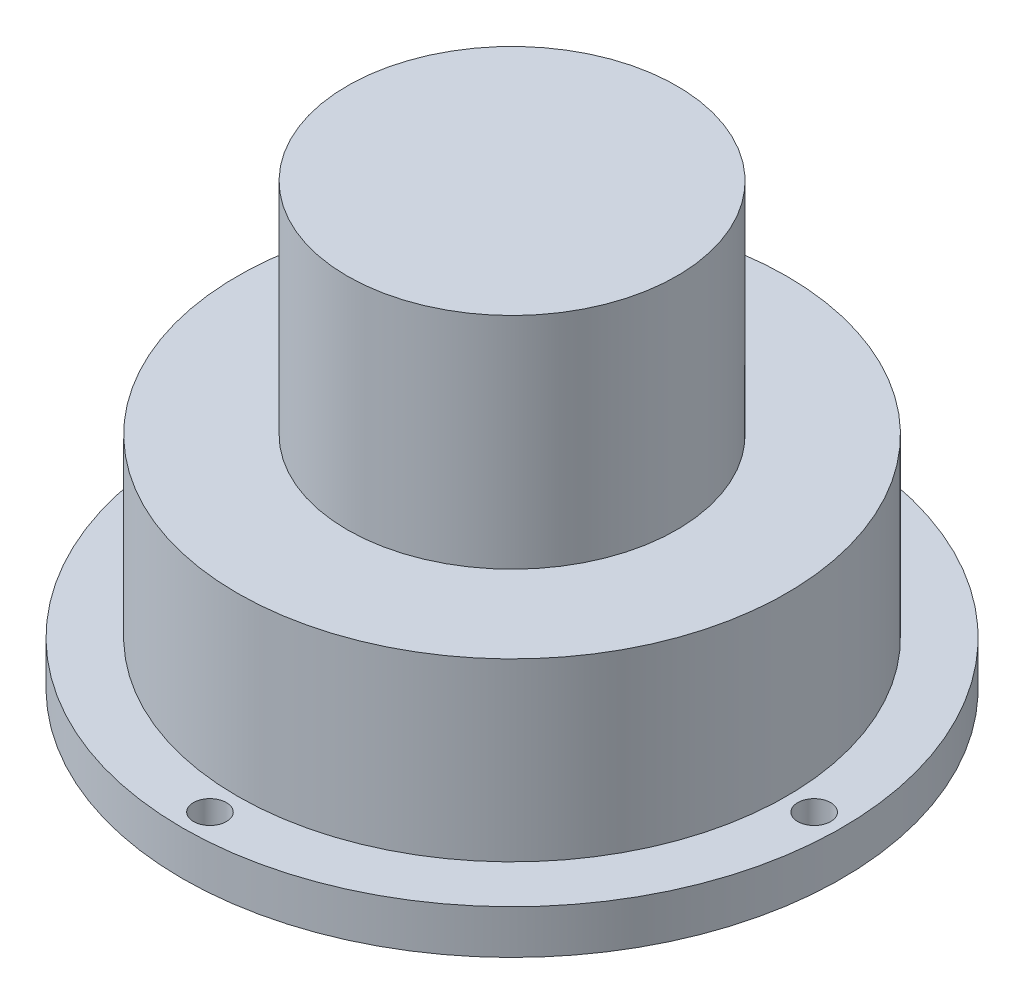
ISO-10303-21;
HEADER;
FILE_DESCRIPTION(('STEP AP214'),'2;1');
FILE_NAME('part.step','',(''),(''),'','','');
FILE_SCHEMA(('AUTOMOTIVE_DESIGN { 1 0 10303 214 1 1 1 1 }'));
ENDSEC;
DATA;
#1=APPLICATION_CONTEXT('core data for automotive mechanical design processes');
#2=APPLICATION_PROTOCOL_DEFINITION('international standard','automotive_design',2000,#1);
#3=PRODUCT_CONTEXT('',#1,'mechanical');
#4=PRODUCT('Part','Part','',(#3));
#5=PRODUCT_RELATED_PRODUCT_CATEGORY('part','',(#4));
#6=PRODUCT_DEFINITION_FORMATION('','',#4);
#7=PRODUCT_DEFINITION_CONTEXT('part definition',#1,'design');
#8=PRODUCT_DEFINITION('design','',#6,#7);
#9=PRODUCT_DEFINITION_SHAPE('','',#8);
#10=(LENGTH_UNIT() NAMED_UNIT(*) SI_UNIT(.MILLI.,.METRE.));
#11=(NAMED_UNIT(*) PLANE_ANGLE_UNIT() SI_UNIT($,.RADIAN.));
#12=(NAMED_UNIT(*) SI_UNIT($,.STERADIAN.) SOLID_ANGLE_UNIT());
#13=UNCERTAINTY_MEASURE_WITH_UNIT(LENGTH_MEASURE(1.E-05),#10,'distance_accuracy_value','');
#14=(GEOMETRIC_REPRESENTATION_CONTEXT(3) GLOBAL_UNCERTAINTY_ASSIGNED_CONTEXT((#13)) GLOBAL_UNIT_ASSIGNED_CONTEXT((#10,
#11,#12)) REPRESENTATION_CONTEXT('',''));
#15=CARTESIAN_POINT('',(0.,0.,0.));
#16=DIRECTION('',(0.,0.,1.));
#17=DIRECTION('',(1.,0.,0.));
#18=AXIS2_PLACEMENT_3D('',#15,#16,#17);
#19=CARTESIAN_POINT('',(0.,20.,0.));
#20=DIRECTION('',(0.,1.,0.));
#21=DIRECTION('',(0.,0.,1.));
#22=AXIS2_PLACEMENT_3D('',#19,#20,#21);
#23=PLANE('',#22);
#24=CARTESIAN_POINT('',(1.44023605227279E-12,20.,-137.5));
#25=DIRECTION('',(0.,1.,0.));
#26=DIRECTION('',(0.,0.,1.));
#27=AXIS2_PLACEMENT_3D('',#24,#25,#26);
#28=CIRCLE('',#27,7.5);
#29=CARTESIAN_POINT('',(1.44023605227279E-12,20.,-130.));
#30=VERTEX_POINT('',#29);
#31=EDGE_CURVE('E117',#30,#30,#28,.T.);
#32=ORIENTED_EDGE('',*,*,#31,.F.);
#33=EDGE_LOOP('',(#32));
#34=FACE_BOUND('',#33,.T.);
#35=CARTESIAN_POINT('',(-137.5,20.,0.));
#36=DIRECTION('',(0.,1.,0.));
#37=DIRECTION('',(0.,0.,1.));
#38=AXIS2_PLACEMENT_3D('',#35,#36,#37);
#39=CIRCLE('',#38,7.50000000000001);
#40=CARTESIAN_POINT('',(-137.5,20.,7.50000000000001));
#41=VERTEX_POINT('',#40);
#42=EDGE_CURVE('E119',#41,#41,#39,.T.);
#43=ORIENTED_EDGE('',*,*,#42,.F.);
#44=EDGE_LOOP('',(#43));
#45=FACE_BOUND('',#44,.T.);
#46=CARTESIAN_POINT('',(-4.80078684090931E-13,20.,137.5));
#47=DIRECTION('',(0.,1.,0.));
#48=DIRECTION('',(0.,0.,1.));
#49=AXIS2_PLACEMENT_3D('',#46,#47,#48);
#50=CIRCLE('',#49,7.5);
#51=CARTESIAN_POINT('',(-4.80078684090931E-13,20.,145.));
#52=VERTEX_POINT('',#51);
#53=EDGE_CURVE('E127',#52,#52,#50,.T.);
#54=ORIENTED_EDGE('',*,*,#53,.F.);
#55=EDGE_LOOP('',(#54));
#56=FACE_BOUND('',#55,.T.);
#57=CARTESIAN_POINT('',(137.5,20.,0.));
#58=DIRECTION('',(0.,1.,0.));
#59=DIRECTION('',(0.,0.,1.));
#60=AXIS2_PLACEMENT_3D('',#57,#58,#59);
#61=CIRCLE('',#60,7.50000000000001);
#62=CARTESIAN_POINT('',(137.5,20.,7.50000000000001));
#63=VERTEX_POINT('',#62);
#64=EDGE_CURVE('E133',#63,#63,#61,.T.);
#65=ORIENTED_EDGE('',*,*,#64,.F.);
#66=EDGE_LOOP('',(#65));
#67=FACE_BOUND('',#66,.T.);
#68=CARTESIAN_POINT('',(0.,20.,0.));
#69=DIRECTION('',(0.,1.,0.));
#70=DIRECTION('',(0.,0.,1.));
#71=AXIS2_PLACEMENT_3D('',#68,#69,#70);
#72=CIRCLE('',#71,150.);
#73=CARTESIAN_POINT('',(0.,20.,150.));
#74=VERTEX_POINT('',#73);
#75=EDGE_CURVE('E47',#74,#74,#72,.T.);
#76=ORIENTED_EDGE('',*,*,#75,.T.);
#77=EDGE_LOOP('',(#76));
#78=FACE_BOUND('',#77,.T.);
#79=CARTESIAN_POINT('',(0.,20.,0.));
#80=DIRECTION('',(0.,1.,0.));
#81=DIRECTION('',(0.,0.,1.));
#82=AXIS2_PLACEMENT_3D('',#79,#80,#81);
#83=CIRCLE('',#82,125.);
#84=CARTESIAN_POINT('',(0.,20.,125.));
#85=VERTEX_POINT('',#84);
#86=EDGE_CURVE('E59',#85,#85,#83,.T.);
#87=ORIENTED_EDGE('',*,*,#86,.F.);
#88=EDGE_LOOP('',(#87));
#89=FACE_BOUND('',#88,.T.);
#90=ADVANCED_FACE('F39',(#34,#45,#56,#67,#78,#89),#23,.T.);
#91=CARTESIAN_POINT('',(0.,0.,0.));
#92=DIRECTION('',(0.,1.,0.));
#93=DIRECTION('',(0.,0.,1.));
#94=AXIS2_PLACEMENT_3D('',#91,#92,#93);
#95=PLANE('',#94);
#96=CARTESIAN_POINT('',(1.44023605227279E-12,0.,-137.5));
#97=DIRECTION('',(0.,1.,0.));
#98=DIRECTION('',(0.,0.,1.));
#99=AXIS2_PLACEMENT_3D('',#96,#97,#98);
#100=CIRCLE('',#99,7.5);
#101=CARTESIAN_POINT('',(1.44023605227279E-12,0.,-130.));
#102=VERTEX_POINT('',#101);
#103=EDGE_CURVE('E114',#102,#102,#100,.T.);
#104=ORIENTED_EDGE('',*,*,#103,.T.);
#105=EDGE_LOOP('',(#104));
#106=FACE_BOUND('',#105,.T.);
#107=CARTESIAN_POINT('',(-137.5,0.,0.));
#108=DIRECTION('',(0.,1.,0.));
#109=DIRECTION('',(0.,0.,1.));
#110=AXIS2_PLACEMENT_3D('',#107,#108,#109);
#111=CIRCLE('',#110,7.50000000000001);
#112=CARTESIAN_POINT('',(-137.5,0.,7.50000000000001));
#113=VERTEX_POINT('',#112);
#114=EDGE_CURVE('E124',#113,#113,#111,.T.);
#115=ORIENTED_EDGE('',*,*,#114,.T.);
#116=EDGE_LOOP('',(#115));
#117=FACE_BOUND('',#116,.T.);
#118=CARTESIAN_POINT('',(-4.80078684090931E-13,0.,137.5));
#119=DIRECTION('',(0.,1.,0.));
#120=DIRECTION('',(0.,0.,1.));
#121=AXIS2_PLACEMENT_3D('',#118,#119,#120);
#122=CIRCLE('',#121,7.5);
#123=CARTESIAN_POINT('',(-4.80078684090931E-13,0.,145.));
#124=VERTEX_POINT('',#123);
#125=EDGE_CURVE('E130',#124,#124,#122,.T.);
#126=ORIENTED_EDGE('',*,*,#125,.T.);
#127=EDGE_LOOP('',(#126));
#128=FACE_BOUND('',#127,.T.);
#129=CARTESIAN_POINT('',(137.5,0.,0.));
#130=DIRECTION('',(0.,1.,0.));
#131=DIRECTION('',(0.,0.,1.));
#132=AXIS2_PLACEMENT_3D('',#129,#130,#131);
#133=CIRCLE('',#132,7.50000000000001);
#134=CARTESIAN_POINT('',(137.5,0.,7.50000000000001));
#135=VERTEX_POINT('',#134);
#136=EDGE_CURVE('E135',#135,#135,#133,.T.);
#137=ORIENTED_EDGE('',*,*,#136,.T.);
#138=EDGE_LOOP('',(#137));
#139=FACE_BOUND('',#138,.T.);
#140=CARTESIAN_POINT('',(0.,0.,0.));
#141=DIRECTION('',(0.,1.,0.));
#142=DIRECTION('',(0.,0.,1.));
#143=AXIS2_PLACEMENT_3D('',#140,#141,#142);
#144=CIRCLE('',#143,150.);
#145=CARTESIAN_POINT('',(0.,0.,150.));
#146=VERTEX_POINT('',#145);
#147=EDGE_CURVE('E43',#146,#146,#144,.T.);
#148=ORIENTED_EDGE('',*,*,#147,.F.);
#149=EDGE_LOOP('',(#148));
#150=FACE_BOUND('',#149,.T.);
#151=ADVANCED_FACE('F67',(#106,#117,#128,#139,#150),#95,.F.);
#152=CARTESIAN_POINT('',(0.,20.,0.));
#153=DIRECTION('',(0.,-1.,0.));
#154=DIRECTION('',(0.,0.,-1.));
#155=AXIS2_PLACEMENT_3D('',#152,#153,#154);
#156=CYLINDRICAL_SURFACE('',#155,150.);
#157=ORIENTED_EDGE('',*,*,#75,.F.);
#158=EDGE_LOOP('',(#157));
#159=FACE_BOUND('',#158,.T.);
#160=ORIENTED_EDGE('',*,*,#147,.T.);
#161=EDGE_LOOP('',(#160));
#162=FACE_BOUND('',#161,.T.);
#163=ADVANCED_FACE('F41',(#159,#162),#156,.T.);
#164=CARTESIAN_POINT('',(0.,100.,0.));
#165=DIRECTION('',(0.,-1.,0.));
#166=DIRECTION('',(0.,0.,-1.));
#167=AXIS2_PLACEMENT_3D('',#164,#165,#166);
#168=CYLINDRICAL_SURFACE('',#167,125.);
#169=ORIENTED_EDGE('',*,*,#86,.T.);
#170=EDGE_LOOP('',(#169));
#171=FACE_BOUND('',#170,.T.);
#172=CARTESIAN_POINT('',(0.,100.,0.));
#173=DIRECTION('',(0.,1.,0.));
#174=DIRECTION('',(0.,0.,1.));
#175=AXIS2_PLACEMENT_3D('',#172,#173,#174);
#176=CIRCLE('',#175,125.);
#177=CARTESIAN_POINT('',(0.,100.,125.));
#178=VERTEX_POINT('',#177);
#179=EDGE_CURVE('E56',#178,#178,#176,.T.);
#180=ORIENTED_EDGE('',*,*,#179,.F.);
#181=EDGE_LOOP('',(#180));
#182=FACE_BOUND('',#181,.T.);
#183=ADVANCED_FACE('F75',(#171,#182),#168,.T.);
#184=CARTESIAN_POINT('',(0.,100.,0.));
#185=DIRECTION('',(0.,1.,0.));
#186=DIRECTION('',(0.,0.,1.));
#187=AXIS2_PLACEMENT_3D('',#184,#185,#186);
#188=PLANE('',#187);
#189=CARTESIAN_POINT('',(0.,100.,0.));
#190=DIRECTION('',(0.,1.,0.));
#191=DIRECTION('',(0.,0.,1.));
#192=AXIS2_PLACEMENT_3D('',#189,#190,#191);
#193=CIRCLE('',#192,75.);
#194=CARTESIAN_POINT('',(0.,100.,75.));
#195=VERTEX_POINT('',#194);
#196=EDGE_CURVE('E10',#195,#195,#193,.T.);
#197=ORIENTED_EDGE('',*,*,#196,.F.);
#198=EDGE_LOOP('',(#197));
#199=FACE_BOUND('',#198,.T.);
#200=ORIENTED_EDGE('',*,*,#179,.T.);
#201=EDGE_LOOP('',(#200));
#202=FACE_BOUND('',#201,.T.);
#203=ADVANCED_FACE('F84',(#199,#202),#188,.T.);
#204=CARTESIAN_POINT('',(0.,200.,0.));
#205=DIRECTION('',(0.,-1.,0.));
#206=DIRECTION('',(0.,0.,-1.));
#207=AXIS2_PLACEMENT_3D('',#204,#205,#206);
#208=CYLINDRICAL_SURFACE('',#207,75.);
#209=CARTESIAN_POINT('',(0.,200.,0.));
#210=DIRECTION('',(0.,1.,0.));
#211=DIRECTION('',(0.,0.,1.));
#212=AXIS2_PLACEMENT_3D('',#209,#210,#211);
#213=CIRCLE('',#212,75.);
#214=CARTESIAN_POINT('',(0.,200.,75.));
#215=VERTEX_POINT('',#214);
#216=EDGE_CURVE('E54',#215,#215,#213,.T.);
#217=ORIENTED_EDGE('',*,*,#216,.F.);
#218=EDGE_LOOP('',(#217));
#219=FACE_BOUND('',#218,.T.);
#220=ORIENTED_EDGE('',*,*,#196,.T.);
#221=EDGE_LOOP('',(#220));
#222=FACE_BOUND('',#221,.T.);
#223=ADVANCED_FACE('F87',(#219,#222),#208,.T.);
#224=CARTESIAN_POINT('',(0.,200.,0.));
#225=DIRECTION('',(0.,1.,0.));
#226=DIRECTION('',(0.,0.,1.));
#227=AXIS2_PLACEMENT_3D('',#224,#225,#226);
#228=PLANE('',#227);
#229=ORIENTED_EDGE('',*,*,#216,.T.);
#230=EDGE_LOOP('',(#229));
#231=FACE_BOUND('',#230,.T.);
#232=ADVANCED_FACE('F91',(#231),#228,.T.);
#233=CARTESIAN_POINT('',(137.5,20.,0.));
#234=DIRECTION('',(0.,1.,0.));
#235=DIRECTION('',(0.,0.,1.));
#236=AXIS2_PLACEMENT_3D('',#233,#234,#235);
#237=CYLINDRICAL_SURFACE('',#236,7.50000000000001);
#238=ORIENTED_EDGE('',*,*,#136,.F.);
#239=EDGE_LOOP('',(#238));
#240=FACE_BOUND('',#239,.T.);
#241=ORIENTED_EDGE('',*,*,#64,.T.);
#242=EDGE_LOOP('',(#241));
#243=FACE_BOUND('',#242,.T.);
#244=ADVANCED_FACE('F95',(#240,#243),#237,.F.);
#245=CARTESIAN_POINT('',(-4.80078684090931E-13,20.,137.5));
#246=DIRECTION('',(0.,1.,0.));
#247=DIRECTION('',(0.,0.,1.));
#248=AXIS2_PLACEMENT_3D('',#245,#246,#247);
#249=CYLINDRICAL_SURFACE('',#248,7.5);
#250=ORIENTED_EDGE('',*,*,#125,.F.);
#251=EDGE_LOOP('',(#250));
#252=FACE_BOUND('',#251,.T.);
#253=ORIENTED_EDGE('',*,*,#53,.T.);
#254=EDGE_LOOP('',(#253));
#255=FACE_BOUND('',#254,.T.);
#256=ADVANCED_FACE('F99',(#252,#255),#249,.F.);
#257=CARTESIAN_POINT('',(-137.5,20.,0.));
#258=DIRECTION('',(0.,1.,0.));
#259=DIRECTION('',(0.,0.,1.));
#260=AXIS2_PLACEMENT_3D('',#257,#258,#259);
#261=CYLINDRICAL_SURFACE('',#260,7.50000000000001);
#262=ORIENTED_EDGE('',*,*,#114,.F.);
#263=EDGE_LOOP('',(#262));
#264=FACE_BOUND('',#263,.T.);
#265=ORIENTED_EDGE('',*,*,#42,.T.);
#266=EDGE_LOOP('',(#265));
#267=FACE_BOUND('',#266,.T.);
#268=ADVANCED_FACE('F102',(#264,#267),#261,.F.);
#269=CARTESIAN_POINT('',(1.44023605227279E-12,20.,-137.5));
#270=DIRECTION('',(0.,1.,0.));
#271=DIRECTION('',(0.,0.,1.));
#272=AXIS2_PLACEMENT_3D('',#269,#270,#271);
#273=CYLINDRICAL_SURFACE('',#272,7.5);
#274=ORIENTED_EDGE('',*,*,#103,.F.);
#275=EDGE_LOOP('',(#274));
#276=FACE_BOUND('',#275,.T.);
#277=ORIENTED_EDGE('',*,*,#31,.T.);
#278=EDGE_LOOP('',(#277));
#279=FACE_BOUND('',#278,.T.);
#280=ADVANCED_FACE('F106',(#276,#279),#273,.F.);
#281=CLOSED_SHELL('',(#90,#151,#163,#183,#203,#223,#232,#244,#256,#268,#280));
#282=MANIFOLD_SOLID_BREP('B2',#281);
#283=ADVANCED_BREP_SHAPE_REPRESENTATION('',(#18,#282),#14);
#284=SHAPE_DEFINITION_REPRESENTATION(#9,#283);
ENDSEC;
END-ISO-10303-21;
